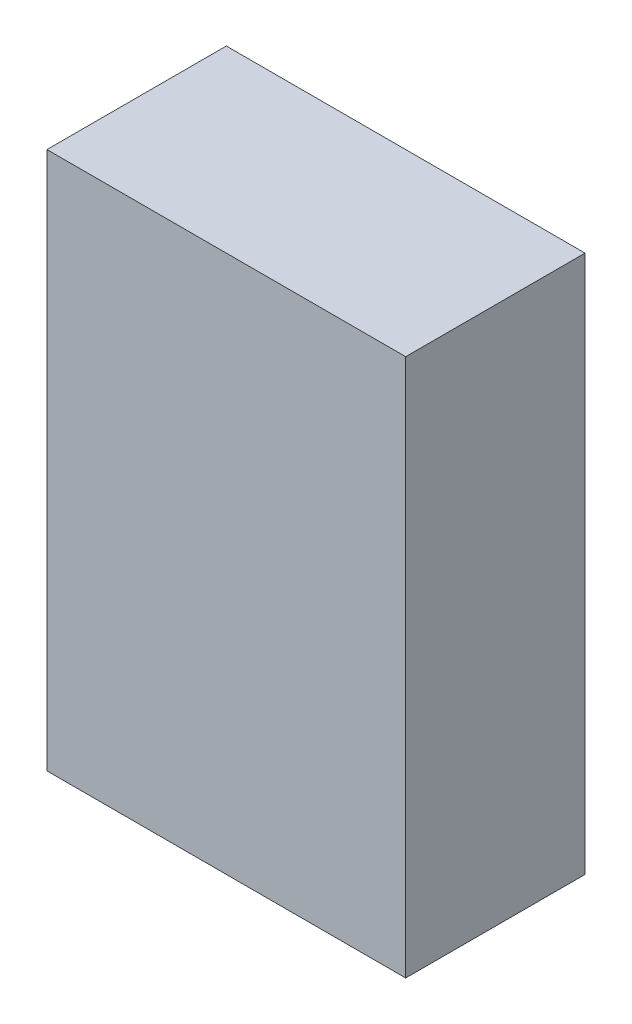
ISO-10303-21;
HEADER;
FILE_DESCRIPTION(('STEP AP214'),'2;1');
FILE_NAME('part.step','',(''),(''),'','','');
FILE_SCHEMA(('AUTOMOTIVE_DESIGN { 1 0 10303 214 1 1 1 1 }'));
ENDSEC;
DATA;
#1=APPLICATION_CONTEXT('core data for automotive mechanical design processes');
#2=APPLICATION_PROTOCOL_DEFINITION('international standard','automotive_design',2000,#1);
#3=PRODUCT_CONTEXT('',#1,'mechanical');
#4=PRODUCT('Part','Part','',(#3));
#5=PRODUCT_RELATED_PRODUCT_CATEGORY('part','',(#4));
#6=PRODUCT_DEFINITION_FORMATION('','',#4);
#7=PRODUCT_DEFINITION_CONTEXT('part definition',#1,'design');
#8=PRODUCT_DEFINITION('design','',#6,#7);
#9=PRODUCT_DEFINITION_SHAPE('','',#8);
#10=(LENGTH_UNIT() NAMED_UNIT(*) SI_UNIT(.MILLI.,.METRE.));
#11=(NAMED_UNIT(*) PLANE_ANGLE_UNIT() SI_UNIT($,.RADIAN.));
#12=(NAMED_UNIT(*) SI_UNIT($,.STERADIAN.) SOLID_ANGLE_UNIT());
#13=UNCERTAINTY_MEASURE_WITH_UNIT(LENGTH_MEASURE(1.E-05),#10,'distance_accuracy_value','');
#14=(GEOMETRIC_REPRESENTATION_CONTEXT(3) GLOBAL_UNCERTAINTY_ASSIGNED_CONTEXT((#13)) GLOBAL_UNIT_ASSIGNED_CONTEXT((#10,
#11,#12)) REPRESENTATION_CONTEXT('',''));
#15=CARTESIAN_POINT('',(0.,0.,0.));
#16=DIRECTION('',(0.,0.,1.));
#17=DIRECTION('',(1.,0.,0.));
#18=AXIS2_PLACEMENT_3D('',#15,#16,#17);
#19=CARTESIAN_POINT('',(25.4,76.2,12.7));
#20=DIRECTION('',(-1.,0.,0.));
#21=DIRECTION('',(0.,0.,1.));
#22=AXIS2_PLACEMENT_3D('',#19,#20,#21);
#23=PLANE('',#22);
#24=DIRECTION('',(0.,0.,-1.));
#25=VECTOR('',#24,1.);
#26=CARTESIAN_POINT('',(25.4,0.,12.7));
#27=LINE('',#26,#25);
#28=CARTESIAN_POINT('',(25.4,0.,12.7));
#29=VERTEX_POINT('',#28);
#30=CARTESIAN_POINT('',(25.4,0.,-12.7));
#31=VERTEX_POINT('',#30);
#32=EDGE_CURVE('E96',#29,#31,#27,.T.);
#33=ORIENTED_EDGE('',*,*,#32,.T.);
#34=DIRECTION('',(0.,-1.,0.));
#35=VECTOR('',#34,1.);
#36=CARTESIAN_POINT('',(25.4,76.2,-12.7));
#37=LINE('',#36,#35);
#38=CARTESIAN_POINT('',(25.4,76.2,-12.7));
#39=VERTEX_POINT('',#38);
#40=EDGE_CURVE('E11',#39,#31,#37,.T.);
#41=ORIENTED_EDGE('',*,*,#40,.F.);
#42=DIRECTION('',(0.,0.,-1.));
#43=VECTOR('',#42,1.);
#44=CARTESIAN_POINT('',(25.4,76.2,12.7));
#45=LINE('',#44,#43);
#46=CARTESIAN_POINT('',(25.4,76.2,12.7));
#47=VERTEX_POINT('',#46);
#48=EDGE_CURVE('E84',#47,#39,#45,.T.);
#49=ORIENTED_EDGE('',*,*,#48,.F.);
#50=DIRECTION('',(0.,-1.,0.));
#51=VECTOR('',#50,1.);
#52=CARTESIAN_POINT('',(25.4,76.2,12.7));
#53=LINE('',#52,#51);
#54=EDGE_CURVE('E92',#47,#29,#53,.T.);
#55=ORIENTED_EDGE('',*,*,#54,.T.);
#56=EDGE_LOOP('',(#33,#41,#49,#55));
#57=FACE_BOUND('',#56,.T.);
#58=ADVANCED_FACE('F33',(#57),#23,.F.);
#59=CARTESIAN_POINT('',(-25.4,76.2,-12.7));
#60=DIRECTION('',(0.,0.,1.));
#61=DIRECTION('',(1.,0.,0.));
#62=AXIS2_PLACEMENT_3D('',#59,#60,#61);
#63=PLANE('',#62);
#64=DIRECTION('',(-1.,0.,0.));
#65=VECTOR('',#64,1.);
#66=CARTESIAN_POINT('',(-25.4,0.,-12.7));
#67=LINE('',#66,#65);
#68=CARTESIAN_POINT('',(-25.4,0.,-12.7));
#69=VERTEX_POINT('',#68);
#70=EDGE_CURVE('E88',#31,#69,#67,.T.);
#71=ORIENTED_EDGE('',*,*,#70,.T.);
#72=DIRECTION('',(0.,-1.,0.));
#73=VECTOR('',#72,1.);
#74=CARTESIAN_POINT('',(-25.4,76.2,-12.7));
#75=LINE('',#74,#73);
#76=CARTESIAN_POINT('',(-25.4,76.2,-12.7));
#77=VERTEX_POINT('',#76);
#78=EDGE_CURVE('E41',#77,#69,#75,.T.);
#79=ORIENTED_EDGE('',*,*,#78,.F.);
#80=DIRECTION('',(-1.,0.,0.));
#81=VECTOR('',#80,1.);
#82=CARTESIAN_POINT('',(-25.4,76.2,-12.7));
#83=LINE('',#82,#81);
#84=EDGE_CURVE('E79',#39,#77,#83,.T.);
#85=ORIENTED_EDGE('',*,*,#84,.F.);
#86=ORIENTED_EDGE('',*,*,#40,.T.);
#87=EDGE_LOOP('',(#71,#79,#85,#86));
#88=FACE_BOUND('',#87,.T.);
#89=ADVANCED_FACE('F87',(#88),#63,.F.);
#90=CARTESIAN_POINT('',(-25.4,76.2,12.7));
#91=DIRECTION('',(1.,0.,0.));
#92=DIRECTION('',(0.,0.,-1.));
#93=AXIS2_PLACEMENT_3D('',#90,#91,#92);
#94=PLANE('',#93);
#95=DIRECTION('',(0.,0.,1.));
#96=VECTOR('',#95,1.);
#97=CARTESIAN_POINT('',(-25.4,0.,12.7));
#98=LINE('',#97,#96);
#99=CARTESIAN_POINT('',(-25.4,0.,12.7));
#100=VERTEX_POINT('',#99);
#101=EDGE_CURVE('E66',#69,#100,#98,.T.);
#102=ORIENTED_EDGE('',*,*,#101,.T.);
#103=DIRECTION('',(0.,-1.,0.));
#104=VECTOR('',#103,1.);
#105=CARTESIAN_POINT('',(-25.4,76.2,12.7));
#106=LINE('',#105,#104);
#107=CARTESIAN_POINT('',(-25.4,76.2,12.7));
#108=VERTEX_POINT('',#107);
#109=EDGE_CURVE('E89',#108,#100,#106,.T.);
#110=ORIENTED_EDGE('',*,*,#109,.F.);
#111=DIRECTION('',(0.,0.,1.));
#112=VECTOR('',#111,1.);
#113=CARTESIAN_POINT('',(-25.4,76.2,12.7));
#114=LINE('',#113,#112);
#115=EDGE_CURVE('E82',#77,#108,#114,.T.);
#116=ORIENTED_EDGE('',*,*,#115,.F.);
#117=ORIENTED_EDGE('',*,*,#78,.T.);
#118=EDGE_LOOP('',(#102,#110,#116,#117));
#119=FACE_BOUND('',#118,.T.);
#120=ADVANCED_FACE('F90',(#119),#94,.F.);
#121=CARTESIAN_POINT('',(-25.4,76.2,12.7));
#122=DIRECTION('',(0.,0.,-1.));
#123=DIRECTION('',(-1.,0.,0.));
#124=AXIS2_PLACEMENT_3D('',#121,#122,#123);
#125=PLANE('',#124);
#126=DIRECTION('',(1.,0.,0.));
#127=VECTOR('',#126,1.);
#128=CARTESIAN_POINT('',(-25.4,0.,12.7));
#129=LINE('',#128,#127);
#130=EDGE_CURVE('E72',#100,#29,#129,.T.);
#131=ORIENTED_EDGE('',*,*,#130,.T.);
#132=ORIENTED_EDGE('',*,*,#54,.F.);
#133=DIRECTION('',(1.,0.,0.));
#134=VECTOR('',#133,1.);
#135=CARTESIAN_POINT('',(-25.4,76.2,12.7));
#136=LINE('',#135,#134);
#137=EDGE_CURVE('E49',#108,#47,#136,.T.);
#138=ORIENTED_EDGE('',*,*,#137,.F.);
#139=ORIENTED_EDGE('',*,*,#109,.T.);
#140=EDGE_LOOP('',(#131,#132,#138,#139));
#141=FACE_BOUND('',#140,.T.);
#142=ADVANCED_FACE('F103',(#141),#125,.F.);
#143=CARTESIAN_POINT('',(0.,76.2,0.));
#144=DIRECTION('',(0.,-1.,0.));
#145=DIRECTION('',(0.,0.,-1.));
#146=AXIS2_PLACEMENT_3D('',#143,#144,#145);
#147=PLANE('',#146);
#148=ORIENTED_EDGE('',*,*,#48,.T.);
#149=ORIENTED_EDGE('',*,*,#84,.T.);
#150=ORIENTED_EDGE('',*,*,#115,.T.);
#151=ORIENTED_EDGE('',*,*,#137,.T.);
#152=EDGE_LOOP('',(#148,#149,#150,#151));
#153=FACE_BOUND('',#152,.T.);
#154=ADVANCED_FACE('F80',(#153),#147,.F.);
#155=CARTESIAN_POINT('',(0.,0.,0.));
#156=DIRECTION('',(0.,-1.,0.));
#157=DIRECTION('',(0.,0.,-1.));
#158=AXIS2_PLACEMENT_3D('',#155,#156,#157);
#159=PLANE('',#158);
#160=ORIENTED_EDGE('',*,*,#32,.F.);
#161=ORIENTED_EDGE('',*,*,#130,.F.);
#162=ORIENTED_EDGE('',*,*,#101,.F.);
#163=ORIENTED_EDGE('',*,*,#70,.F.);
#164=EDGE_LOOP('',(#160,#161,#162,#163));
#165=FACE_BOUND('',#164,.T.);
#166=ADVANCED_FACE('F106',(#165),#159,.T.);
#167=CLOSED_SHELL('',(#58,#89,#120,#142,#154,#166));
#168=MANIFOLD_SOLID_BREP('B2',#167);
#169=ADVANCED_BREP_SHAPE_REPRESENTATION('',(#18,#168),#14);
#170=SHAPE_DEFINITION_REPRESENTATION(#9,#169);
ENDSEC;
END-ISO-10303-21;
